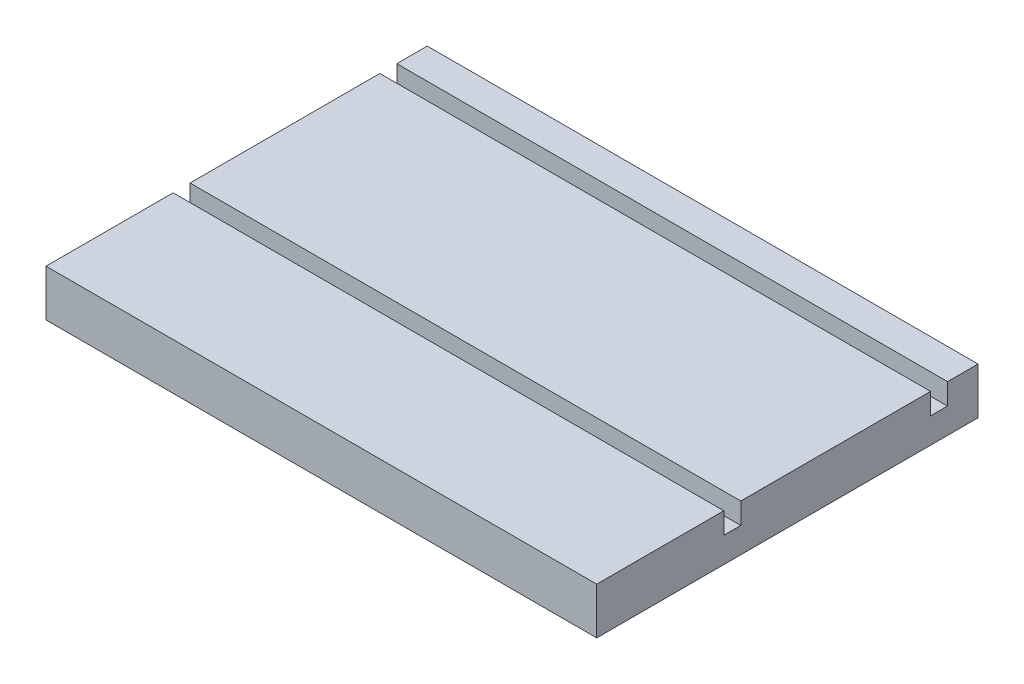
ISO-10303-21;
HEADER;
FILE_DESCRIPTION(('STEP AP214'),'2;1');
FILE_NAME('part.step','',(''),(''),'','','');
FILE_SCHEMA(('AUTOMOTIVE_DESIGN { 1 0 10303 214 1 1 1 1 }'));
ENDSEC;
DATA;
#1=APPLICATION_CONTEXT('core data for automotive mechanical design processes');
#2=APPLICATION_PROTOCOL_DEFINITION('international standard','automotive_design',2000,#1);
#3=PRODUCT_CONTEXT('',#1,'mechanical');
#4=PRODUCT('Part','Part','',(#3));
#5=PRODUCT_RELATED_PRODUCT_CATEGORY('part','',(#4));
#6=PRODUCT_DEFINITION_FORMATION('','',#4);
#7=PRODUCT_DEFINITION_CONTEXT('part definition',#1,'design');
#8=PRODUCT_DEFINITION('design','',#6,#7);
#9=PRODUCT_DEFINITION_SHAPE('','',#8);
#10=(LENGTH_UNIT() NAMED_UNIT(*) SI_UNIT(.MILLI.,.METRE.));
#11=(NAMED_UNIT(*) PLANE_ANGLE_UNIT() SI_UNIT($,.RADIAN.));
#12=(NAMED_UNIT(*) SI_UNIT($,.STERADIAN.) SOLID_ANGLE_UNIT());
#13=UNCERTAINTY_MEASURE_WITH_UNIT(LENGTH_MEASURE(1.E-05),#10,'distance_accuracy_value','');
#14=(GEOMETRIC_REPRESENTATION_CONTEXT(3) GLOBAL_UNCERTAINTY_ASSIGNED_CONTEXT((#13)) GLOBAL_UNIT_ASSIGNED_CONTEXT((#10,
#11,#12)) REPRESENTATION_CONTEXT('',''));
#15=CARTESIAN_POINT('',(0.,0.,0.));
#16=DIRECTION('',(0.,0.,1.));
#17=DIRECTION('',(1.,0.,0.));
#18=AXIS2_PLACEMENT_3D('',#15,#16,#17);
#19=CARTESIAN_POINT('',(0.,55.,0.));
#20=DIRECTION('',(0.,-1.,0.));
#21=DIRECTION('',(0.,0.,-1.));
#22=AXIS2_PLACEMENT_3D('',#19,#20,#21);
#23=PLANE('',#22);
#24=DIRECTION('',(0.,0.,-1.));
#25=VECTOR('',#24,1.);
#26=CARTESIAN_POINT('',(650.,55.,0.));
#27=LINE('',#26,#25);
#28=CARTESIAN_POINT('',(650.,55.,-170.));
#29=VERTEX_POINT('',#28);
#30=CARTESIAN_POINT('',(650.,55.,-394.));
#31=VERTEX_POINT('',#30);
#32=EDGE_CURVE('E197',#29,#31,#27,.T.);
#33=ORIENTED_EDGE('',*,*,#32,.T.);
#34=DIRECTION('',(1.,0.,0.));
#35=VECTOR('',#34,1.);
#36=CARTESIAN_POINT('',(0.,55.,-394.));
#37=LINE('',#36,#35);
#38=CARTESIAN_POINT('',(0.,55.,-394.));
#39=VERTEX_POINT('',#38);
#40=EDGE_CURVE('E158',#39,#31,#37,.T.);
#41=ORIENTED_EDGE('',*,*,#40,.F.);
#42=DIRECTION('',(0.,0.,1.));
#43=VECTOR('',#42,1.);
#44=CARTESIAN_POINT('',(0.,55.,0.));
#45=LINE('',#44,#43);
#46=CARTESIAN_POINT('',(0.,55.,-170.));
#47=VERTEX_POINT('',#46);
#48=EDGE_CURVE('E149',#39,#47,#45,.T.);
#49=ORIENTED_EDGE('',*,*,#48,.T.);
#50=DIRECTION('',(1.,0.,0.));
#51=VECTOR('',#50,1.);
#52=CARTESIAN_POINT('',(0.,55.,-170.));
#53=LINE('',#52,#51);
#54=EDGE_CURVE('E169',#47,#29,#53,.T.);
#55=ORIENTED_EDGE('',*,*,#54,.T.);
#56=EDGE_LOOP('',(#33,#41,#49,#55));
#57=FACE_BOUND('',#56,.T.);
#58=ADVANCED_FACE('F37',(#57),#23,.F.);
#59=CARTESIAN_POINT('',(650.,55.,0.));
#60=VERTEX_POINT('',#59);
#61=CARTESIAN_POINT('',(650.,55.,-150.));
#62=VERTEX_POINT('',#61);
#63=EDGE_CURVE('E193',#60,#62,#27,.T.);
#64=ORIENTED_EDGE('',*,*,#63,.T.);
#65=DIRECTION('',(1.,0.,0.));
#66=VECTOR('',#65,1.);
#67=CARTESIAN_POINT('',(0.,55.,-150.));
#68=LINE('',#67,#66);
#69=CARTESIAN_POINT('',(0.,55.,-150.));
#70=VERTEX_POINT('',#69);
#71=EDGE_CURVE('E171',#70,#62,#68,.T.);
#72=ORIENTED_EDGE('',*,*,#71,.F.);
#73=CARTESIAN_POINT('',(0.,55.,0.));
#74=VERTEX_POINT('',#73);
#75=EDGE_CURVE('E190',#70,#74,#45,.T.);
#76=ORIENTED_EDGE('',*,*,#75,.T.);
#77=DIRECTION('',(1.,0.,0.));
#78=VECTOR('',#77,1.);
#79=CARTESIAN_POINT('',(0.,55.,0.));
#80=LINE('',#79,#78);
#81=EDGE_CURVE('E189',#74,#60,#80,.T.);
#82=ORIENTED_EDGE('',*,*,#81,.T.);
#83=EDGE_LOOP('',(#64,#72,#76,#82));
#84=FACE_BOUND('',#83,.T.);
#85=ADVANCED_FACE('F248',(#84),#23,.F.);
#86=CARTESIAN_POINT('',(0.,55.,0.));
#87=DIRECTION('',(1.,0.,0.));
#88=DIRECTION('',(0.,0.,-1.));
#89=AXIS2_PLACEMENT_3D('',#86,#87,#88);
#90=PLANE('',#89);
#91=ORIENTED_EDGE('',*,*,#48,.F.);
#92=DIRECTION('',(0.,-1.,0.));
#93=VECTOR('',#92,1.);
#94=CARTESIAN_POINT('',(0.,55.,-394.));
#95=LINE('',#94,#93);
#96=CARTESIAN_POINT('',(0.,30.,-394.));
#97=VERTEX_POINT('',#96);
#98=EDGE_CURVE('E129',#39,#97,#95,.T.);
#99=ORIENTED_EDGE('',*,*,#98,.T.);
#100=DIRECTION('',(0.,0.,-1.));
#101=VECTOR('',#100,1.);
#102=CARTESIAN_POINT('',(0.,30.,-394.));
#103=LINE('',#102,#101);
#104=CARTESIAN_POINT('',(0.,30.,-414.));
#105=VERTEX_POINT('',#104);
#106=EDGE_CURVE('E140',#97,#105,#103,.T.);
#107=ORIENTED_EDGE('',*,*,#106,.T.);
#108=DIRECTION('',(0.,1.,0.));
#109=VECTOR('',#108,1.);
#110=CARTESIAN_POINT('',(0.,55.,-414.));
#111=LINE('',#110,#109);
#112=CARTESIAN_POINT('',(0.,55.,-414.));
#113=VERTEX_POINT('',#112);
#114=EDGE_CURVE('E137',#105,#113,#111,.T.);
#115=ORIENTED_EDGE('',*,*,#114,.T.);
#116=CARTESIAN_POINT('',(0.,55.,-450.));
#117=VERTEX_POINT('',#116);
#118=EDGE_CURVE('E186',#117,#113,#45,.T.);
#119=ORIENTED_EDGE('',*,*,#118,.F.);
#120=DIRECTION('',(0.,-1.,0.));
#121=VECTOR('',#120,1.);
#122=CARTESIAN_POINT('',(0.,55.,-450.));
#123=LINE('',#122,#121);
#124=CARTESIAN_POINT('',(0.,0.,-450.));
#125=VERTEX_POINT('',#124);
#126=EDGE_CURVE('E199',#117,#125,#123,.T.);
#127=ORIENTED_EDGE('',*,*,#126,.T.);
#128=DIRECTION('',(0.,0.,1.));
#129=VECTOR('',#128,1.);
#130=CARTESIAN_POINT('',(0.,0.,0.));
#131=LINE('',#130,#129);
#132=CARTESIAN_POINT('',(0.,0.,0.));
#133=VERTEX_POINT('',#132);
#134=EDGE_CURVE('E160',#125,#133,#131,.T.);
#135=ORIENTED_EDGE('',*,*,#134,.T.);
#136=DIRECTION('',(0.,-1.,0.));
#137=VECTOR('',#136,1.);
#138=CARTESIAN_POINT('',(0.,55.,0.));
#139=LINE('',#138,#137);
#140=EDGE_CURVE('E11',#74,#133,#139,.T.);
#141=ORIENTED_EDGE('',*,*,#140,.F.);
#142=ORIENTED_EDGE('',*,*,#75,.F.);
#143=DIRECTION('',(0.,-1.,0.));
#144=VECTOR('',#143,1.);
#145=CARTESIAN_POINT('',(0.,55.,-150.));
#146=LINE('',#145,#144);
#147=CARTESIAN_POINT('',(0.,30.,-150.));
#148=VERTEX_POINT('',#147);
#149=EDGE_CURVE('E175',#70,#148,#146,.T.);
#150=ORIENTED_EDGE('',*,*,#149,.T.);
#151=DIRECTION('',(0.,0.,-1.));
#152=VECTOR('',#151,1.);
#153=CARTESIAN_POINT('',(0.,30.,-150.));
#154=LINE('',#153,#152);
#155=CARTESIAN_POINT('',(0.,30.,-170.));
#156=VERTEX_POINT('',#155);
#157=EDGE_CURVE('E181',#148,#156,#154,.T.);
#158=ORIENTED_EDGE('',*,*,#157,.T.);
#159=DIRECTION('',(0.,1.,0.));
#160=VECTOR('',#159,1.);
#161=CARTESIAN_POINT('',(0.,55.,-170.));
#162=LINE('',#161,#160);
#163=EDGE_CURVE('E166',#156,#47,#162,.T.);
#164=ORIENTED_EDGE('',*,*,#163,.T.);
#165=EDGE_LOOP('',(#91,#99,#107,#115,#119,#127,#135,#141,#142,#150,#158,#164));
#166=FACE_BOUND('',#165,.T.);
#167=ADVANCED_FACE('F39',(#166),#90,.F.);
#168=CARTESIAN_POINT('',(0.,55.,0.));
#169=DIRECTION('',(0.,0.,-1.));
#170=DIRECTION('',(-1.,0.,0.));
#171=AXIS2_PLACEMENT_3D('',#168,#169,#170);
#172=PLANE('',#171);
#173=DIRECTION('',(1.,0.,0.));
#174=VECTOR('',#173,1.);
#175=CARTESIAN_POINT('',(0.,0.,0.));
#176=LINE('',#175,#174);
#177=CARTESIAN_POINT('',(650.,0.,0.));
#178=VERTEX_POINT('',#177);
#179=EDGE_CURVE('E202',#133,#178,#176,.T.);
#180=ORIENTED_EDGE('',*,*,#179,.T.);
#181=DIRECTION('',(0.,-1.,0.));
#182=VECTOR('',#181,1.);
#183=CARTESIAN_POINT('',(650.,55.,0.));
#184=LINE('',#183,#182);
#185=EDGE_CURVE('E45',#60,#178,#184,.T.);
#186=ORIENTED_EDGE('',*,*,#185,.F.);
#187=ORIENTED_EDGE('',*,*,#81,.F.);
#188=ORIENTED_EDGE('',*,*,#140,.T.);
#189=EDGE_LOOP('',(#180,#186,#187,#188));
#190=FACE_BOUND('',#189,.T.);
#191=ADVANCED_FACE('F249',(#190),#172,.F.);
#192=CARTESIAN_POINT('',(650.,55.,0.));
#193=DIRECTION('',(-1.,0.,0.));
#194=DIRECTION('',(0.,0.,1.));
#195=AXIS2_PLACEMENT_3D('',#192,#193,#194);
#196=PLANE('',#195);
#197=DIRECTION('',(0.,0.,-1.));
#198=VECTOR('',#197,1.);
#199=CARTESIAN_POINT('',(650.,30.,-394.));
#200=LINE('',#199,#198);
#201=CARTESIAN_POINT('',(650.,30.,-394.));
#202=VERTEX_POINT('',#201);
#203=CARTESIAN_POINT('',(650.,30.,-414.));
#204=VERTEX_POINT('',#203);
#205=EDGE_CURVE('E151',#202,#204,#200,.T.);
#206=ORIENTED_EDGE('',*,*,#205,.F.);
#207=DIRECTION('',(0.,-1.,0.));
#208=VECTOR('',#207,1.);
#209=CARTESIAN_POINT('',(650.,55.,-394.));
#210=LINE('',#209,#208);
#211=EDGE_CURVE('E132',#31,#202,#210,.T.);
#212=ORIENTED_EDGE('',*,*,#211,.F.);
#213=ORIENTED_EDGE('',*,*,#32,.F.);
#214=DIRECTION('',(0.,1.,0.));
#215=VECTOR('',#214,1.);
#216=CARTESIAN_POINT('',(650.,55.,-170.));
#217=LINE('',#216,#215);
#218=CARTESIAN_POINT('',(650.,30.,-170.));
#219=VERTEX_POINT('',#218);
#220=EDGE_CURVE('E60',#219,#29,#217,.T.);
#221=ORIENTED_EDGE('',*,*,#220,.F.);
#222=DIRECTION('',(0.,0.,-1.));
#223=VECTOR('',#222,1.);
#224=CARTESIAN_POINT('',(650.,30.,-150.));
#225=LINE('',#224,#223);
#226=CARTESIAN_POINT('',(650.,30.,-150.));
#227=VERTEX_POINT('',#226);
#228=EDGE_CURVE('E174',#227,#219,#225,.T.);
#229=ORIENTED_EDGE('',*,*,#228,.F.);
#230=DIRECTION('',(0.,-1.,0.));
#231=VECTOR('',#230,1.);
#232=CARTESIAN_POINT('',(650.,55.,-150.));
#233=LINE('',#232,#231);
#234=EDGE_CURVE('E156',#62,#227,#233,.T.);
#235=ORIENTED_EDGE('',*,*,#234,.F.);
#236=ORIENTED_EDGE('',*,*,#63,.F.);
#237=ORIENTED_EDGE('',*,*,#185,.T.);
#238=DIRECTION('',(0.,0.,-1.));
#239=VECTOR('',#238,1.);
#240=CARTESIAN_POINT('',(650.,0.,0.));
#241=LINE('',#240,#239);
#242=CARTESIAN_POINT('',(650.,0.,-450.));
#243=VERTEX_POINT('',#242);
#244=EDGE_CURVE('E204',#178,#243,#241,.T.);
#245=ORIENTED_EDGE('',*,*,#244,.T.);
#246=DIRECTION('',(0.,-1.,0.));
#247=VECTOR('',#246,1.);
#248=CARTESIAN_POINT('',(650.,55.,-450.));
#249=LINE('',#248,#247);
#250=CARTESIAN_POINT('',(650.,55.,-450.));
#251=VERTEX_POINT('',#250);
#252=EDGE_CURVE('E210',#251,#243,#249,.T.);
#253=ORIENTED_EDGE('',*,*,#252,.F.);
#254=CARTESIAN_POINT('',(650.,55.,-414.));
#255=VERTEX_POINT('',#254);
#256=EDGE_CURVE('E192',#255,#251,#27,.T.);
#257=ORIENTED_EDGE('',*,*,#256,.F.);
#258=DIRECTION('',(0.,1.,0.));
#259=VECTOR('',#258,1.);
#260=CARTESIAN_POINT('',(650.,55.,-414.));
#261=LINE('',#260,#259);
#262=EDGE_CURVE('E52',#204,#255,#261,.T.);
#263=ORIENTED_EDGE('',*,*,#262,.F.);
#264=EDGE_LOOP('',(#206,#212,#213,#221,#229,#235,#236,#237,#245,#253,#257,#263));
#265=FACE_BOUND('',#264,.T.);
#266=ADVANCED_FACE('F217',(#265),#196,.F.);
#267=CARTESIAN_POINT('',(0.,55.,-450.));
#268=DIRECTION('',(0.,0.,1.));
#269=DIRECTION('',(1.,0.,0.));
#270=AXIS2_PLACEMENT_3D('',#267,#268,#269);
#271=PLANE('',#270);
#272=DIRECTION('',(-1.,0.,0.));
#273=VECTOR('',#272,1.);
#274=CARTESIAN_POINT('',(0.,0.,-450.));
#275=LINE('',#274,#273);
#276=EDGE_CURVE('E206',#243,#125,#275,.T.);
#277=ORIENTED_EDGE('',*,*,#276,.T.);
#278=ORIENTED_EDGE('',*,*,#126,.F.);
#279=DIRECTION('',(-1.,0.,0.));
#280=VECTOR('',#279,1.);
#281=CARTESIAN_POINT('',(0.,55.,-450.));
#282=LINE('',#281,#280);
#283=EDGE_CURVE('E196',#251,#117,#282,.T.);
#284=ORIENTED_EDGE('',*,*,#283,.F.);
#285=ORIENTED_EDGE('',*,*,#252,.T.);
#286=EDGE_LOOP('',(#277,#278,#284,#285));
#287=FACE_BOUND('',#286,.T.);
#288=ADVANCED_FACE('F228',(#287),#271,.F.);
#289=ORIENTED_EDGE('',*,*,#118,.T.);
#290=DIRECTION('',(1.,0.,0.));
#291=VECTOR('',#290,1.);
#292=CARTESIAN_POINT('',(0.,55.,-414.));
#293=LINE('',#292,#291);
#294=EDGE_CURVE('E161',#113,#255,#293,.T.);
#295=ORIENTED_EDGE('',*,*,#294,.T.);
#296=ORIENTED_EDGE('',*,*,#256,.T.);
#297=ORIENTED_EDGE('',*,*,#283,.T.);
#298=EDGE_LOOP('',(#289,#295,#296,#297));
#299=FACE_BOUND('',#298,.T.);
#300=ADVANCED_FACE('F233',(#299),#23,.F.);
#301=CARTESIAN_POINT('',(0.,0.,0.));
#302=DIRECTION('',(0.,-1.,0.));
#303=DIRECTION('',(0.,0.,-1.));
#304=AXIS2_PLACEMENT_3D('',#301,#302,#303);
#305=PLANE('',#304);
#306=ORIENTED_EDGE('',*,*,#134,.F.);
#307=ORIENTED_EDGE('',*,*,#276,.F.);
#308=ORIENTED_EDGE('',*,*,#244,.F.);
#309=ORIENTED_EDGE('',*,*,#179,.F.);
#310=EDGE_LOOP('',(#306,#307,#308,#309));
#311=FACE_BOUND('',#310,.T.);
#312=ADVANCED_FACE('F225',(#311),#305,.T.);
#313=CARTESIAN_POINT('',(0.,55.,-150.));
#314=DIRECTION('',(0.,0.,1.));
#315=DIRECTION('',(0.,-1.,0.));
#316=AXIS2_PLACEMENT_3D('',#313,#314,#315);
#317=PLANE('',#316);
#318=ORIENTED_EDGE('',*,*,#234,.T.);
#319=DIRECTION('',(1.,0.,0.));
#320=VECTOR('',#319,1.);
#321=CARTESIAN_POINT('',(0.,30.,-150.));
#322=LINE('',#321,#320);
#323=EDGE_CURVE('E164',#148,#227,#322,.T.);
#324=ORIENTED_EDGE('',*,*,#323,.F.);
#325=ORIENTED_EDGE('',*,*,#149,.F.);
#326=ORIENTED_EDGE('',*,*,#71,.T.);
#327=EDGE_LOOP('',(#318,#324,#325,#326));
#328=FACE_BOUND('',#327,.T.);
#329=ADVANCED_FACE('F244',(#328),#317,.F.);
#330=CARTESIAN_POINT('',(0.,55.,-170.));
#331=DIRECTION('',(0.,0.,-1.));
#332=DIRECTION('',(-1.,0.,0.));
#333=AXIS2_PLACEMENT_3D('',#330,#331,#332);
#334=PLANE('',#333);
#335=ORIENTED_EDGE('',*,*,#220,.T.);
#336=ORIENTED_EDGE('',*,*,#54,.F.);
#337=ORIENTED_EDGE('',*,*,#163,.F.);
#338=DIRECTION('',(1.,0.,0.));
#339=VECTOR('',#338,1.);
#340=CARTESIAN_POINT('',(0.,30.,-170.));
#341=LINE('',#340,#339);
#342=EDGE_CURVE('E167',#156,#219,#341,.T.);
#343=ORIENTED_EDGE('',*,*,#342,.T.);
#344=EDGE_LOOP('',(#335,#336,#337,#343));
#345=FACE_BOUND('',#344,.T.);
#346=ADVANCED_FACE('F302',(#345),#334,.F.);
#347=CARTESIAN_POINT('',(0.,30.,-150.));
#348=DIRECTION('',(0.,-1.,0.));
#349=DIRECTION('',(0.,0.,-1.));
#350=AXIS2_PLACEMENT_3D('',#347,#348,#349);
#351=PLANE('',#350);
#352=ORIENTED_EDGE('',*,*,#228,.T.);
#353=ORIENTED_EDGE('',*,*,#342,.F.);
#354=ORIENTED_EDGE('',*,*,#157,.F.);
#355=ORIENTED_EDGE('',*,*,#323,.T.);
#356=EDGE_LOOP('',(#352,#353,#354,#355));
#357=FACE_BOUND('',#356,.T.);
#358=ADVANCED_FACE('F240',(#357),#351,.F.);
#359=CARTESIAN_POINT('',(0.,55.,-394.));
#360=DIRECTION('',(0.,0.,1.));
#361=DIRECTION('',(1.,0.,0.));
#362=AXIS2_PLACEMENT_3D('',#359,#360,#361);
#363=PLANE('',#362);
#364=ORIENTED_EDGE('',*,*,#211,.T.);
#365=DIRECTION('',(1.,0.,0.));
#366=VECTOR('',#365,1.);
#367=CARTESIAN_POINT('',(0.,30.,-394.));
#368=LINE('',#367,#366);
#369=EDGE_CURVE('E125',#97,#202,#368,.T.);
#370=ORIENTED_EDGE('',*,*,#369,.F.);
#371=ORIENTED_EDGE('',*,*,#98,.F.);
#372=ORIENTED_EDGE('',*,*,#40,.T.);
#373=EDGE_LOOP('',(#364,#370,#371,#372));
#374=FACE_BOUND('',#373,.T.);
#375=ADVANCED_FACE('F127',(#374),#363,.F.);
#376=CARTESIAN_POINT('',(0.,55.,-414.));
#377=DIRECTION('',(0.,0.,-1.));
#378=DIRECTION('',(-1.,0.,0.));
#379=AXIS2_PLACEMENT_3D('',#376,#377,#378);
#380=PLANE('',#379);
#381=ORIENTED_EDGE('',*,*,#262,.T.);
#382=ORIENTED_EDGE('',*,*,#294,.F.);
#383=ORIENTED_EDGE('',*,*,#114,.F.);
#384=DIRECTION('',(1.,0.,0.));
#385=VECTOR('',#384,1.);
#386=CARTESIAN_POINT('',(0.,30.,-414.));
#387=LINE('',#386,#385);
#388=EDGE_CURVE('E136',#105,#204,#387,.T.);
#389=ORIENTED_EDGE('',*,*,#388,.T.);
#390=EDGE_LOOP('',(#381,#382,#383,#389));
#391=FACE_BOUND('',#390,.T.);
#392=ADVANCED_FACE('F319',(#391),#380,.F.);
#393=CARTESIAN_POINT('',(0.,30.,-394.));
#394=DIRECTION('',(0.,-1.,0.));
#395=DIRECTION('',(0.,0.,-1.));
#396=AXIS2_PLACEMENT_3D('',#393,#394,#395);
#397=PLANE('',#396);
#398=ORIENTED_EDGE('',*,*,#205,.T.);
#399=ORIENTED_EDGE('',*,*,#388,.F.);
#400=ORIENTED_EDGE('',*,*,#106,.F.);
#401=ORIENTED_EDGE('',*,*,#369,.T.);
#402=EDGE_LOOP('',(#398,#399,#400,#401));
#403=FACE_BOUND('',#402,.T.);
#404=ADVANCED_FACE('F141',(#403),#397,.F.);
#405=CLOSED_SHELL('',(#58,#85,#167,#191,#266,#288,#300,#312,#329,#346,#358,#375,#392,#404));
#406=MANIFOLD_SOLID_BREP('B2',#405);
#407=ADVANCED_BREP_SHAPE_REPRESENTATION('',(#18,#406),#14);
#408=SHAPE_DEFINITION_REPRESENTATION(#9,#407);
ENDSEC;
END-ISO-10303-21;
